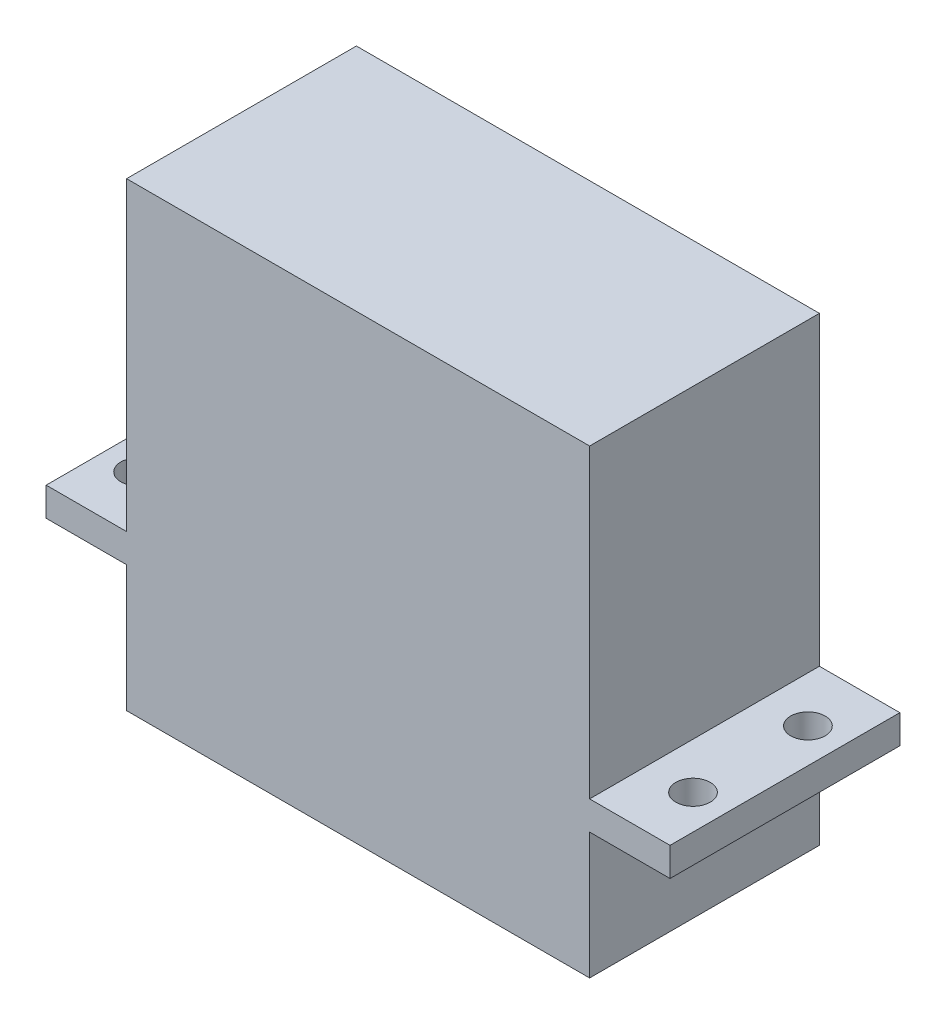
ISO-10303-21;
HEADER;
FILE_DESCRIPTION(('STEP AP214'),'2;1');
FILE_NAME('part.step','',(''),(''),'','','');
FILE_SCHEMA(('AUTOMOTIVE_DESIGN { 1 0 10303 214 1 1 1 1 }'));
ENDSEC;
DATA;
#1=APPLICATION_CONTEXT('core data for automotive mechanical design processes');
#2=APPLICATION_PROTOCOL_DEFINITION('international standard','automotive_design',2000,#1);
#3=PRODUCT_CONTEXT('',#1,'mechanical');
#4=PRODUCT('Part','Part','',(#3));
#5=PRODUCT_RELATED_PRODUCT_CATEGORY('part','',(#4));
#6=PRODUCT_DEFINITION_FORMATION('','',#4);
#7=PRODUCT_DEFINITION_CONTEXT('part definition',#1,'design');
#8=PRODUCT_DEFINITION('design','',#6,#7);
#9=PRODUCT_DEFINITION_SHAPE('','',#8);
#10=(LENGTH_UNIT() NAMED_UNIT(*) SI_UNIT(.MILLI.,.METRE.));
#11=(NAMED_UNIT(*) PLANE_ANGLE_UNIT() SI_UNIT($,.RADIAN.));
#12=(NAMED_UNIT(*) SI_UNIT($,.STERADIAN.) SOLID_ANGLE_UNIT());
#13=UNCERTAINTY_MEASURE_WITH_UNIT(LENGTH_MEASURE(1.E-05),#10,'distance_accuracy_value','');
#14=(GEOMETRIC_REPRESENTATION_CONTEXT(3) GLOBAL_UNCERTAINTY_ASSIGNED_CONTEXT((#13)) GLOBAL_UNIT_ASSIGNED_CONTEXT((#10,
#11,#12)) REPRESENTATION_CONTEXT('',''));
#15=CARTESIAN_POINT('',(0.,0.,0.));
#16=DIRECTION('',(0.,0.,1.));
#17=DIRECTION('',(1.,0.,0.));
#18=AXIS2_PLACEMENT_3D('',#15,#16,#17);
#19=CARTESIAN_POINT('',(-20.15,40.1,10.));
#20=DIRECTION('',(1.,0.,0.));
#21=DIRECTION('',(0.,0.,-1.));
#22=AXIS2_PLACEMENT_3D('',#19,#20,#21);
#23=PLANE('',#22);
#24=DIRECTION('',(0.,0.,-1.));
#25=VECTOR('',#24,1.);
#26=CARTESIAN_POINT('',(-20.15,13.5,-10.));
#27=LINE('',#26,#25);
#28=CARTESIAN_POINT('',(-20.15,13.5,10.));
#29=VERTEX_POINT('',#28);
#30=CARTESIAN_POINT('',(-20.15,13.5,-10.));
#31=VERTEX_POINT('',#30);
#32=EDGE_CURVE('E159',#29,#31,#27,.T.);
#33=ORIENTED_EDGE('',*,*,#32,.F.);
#34=DIRECTION('',(0.,-1.,0.));
#35=VECTOR('',#34,1.);
#36=CARTESIAN_POINT('',(-20.15,40.1,10.));
#37=LINE('',#36,#35);
#38=CARTESIAN_POINT('',(-20.15,40.1,10.));
#39=VERTEX_POINT('',#38);
#40=EDGE_CURVE('E241',#39,#29,#37,.T.);
#41=ORIENTED_EDGE('',*,*,#40,.F.);
#42=DIRECTION('',(0.,0.,1.));
#43=VECTOR('',#42,1.);
#44=CARTESIAN_POINT('',(-20.15,40.1,10.));
#45=LINE('',#44,#43);
#46=CARTESIAN_POINT('',(-20.15,40.1,-10.));
#47=VERTEX_POINT('',#46);
#48=EDGE_CURVE('E217',#47,#39,#45,.T.);
#49=ORIENTED_EDGE('',*,*,#48,.F.);
#50=DIRECTION('',(0.,-1.,0.));
#51=VECTOR('',#50,1.);
#52=CARTESIAN_POINT('',(-20.15,40.1,-10.));
#53=LINE('',#52,#51);
#54=EDGE_CURVE('E71',#47,#31,#53,.T.);
#55=ORIENTED_EDGE('',*,*,#54,.T.);
#56=EDGE_LOOP('',(#33,#41,#49,#55));
#57=FACE_BOUND('',#56,.T.);
#58=ADVANCED_FACE('F45',(#57),#23,.F.);
#59=DIRECTION('',(0.,0.,1.));
#60=VECTOR('',#59,1.);
#61=CARTESIAN_POINT('',(-20.15,11.,-10.));
#62=LINE('',#61,#60);
#63=CARTESIAN_POINT('',(-20.15,11.,-10.));
#64=VERTEX_POINT('',#63);
#65=CARTESIAN_POINT('',(-20.15,11.,10.));
#66=VERTEX_POINT('',#65);
#67=EDGE_CURVE('E63',#64,#66,#62,.T.);
#68=ORIENTED_EDGE('',*,*,#67,.F.);
#69=CARTESIAN_POINT('',(-20.15,0.,-10.));
#70=VERTEX_POINT('',#69);
#71=EDGE_CURVE('E163',#64,#70,#53,.T.);
#72=ORIENTED_EDGE('',*,*,#71,.T.);
#73=DIRECTION('',(0.,0.,1.));
#74=VECTOR('',#73,1.);
#75=CARTESIAN_POINT('',(-20.15,0.,10.));
#76=LINE('',#75,#74);
#77=CARTESIAN_POINT('',(-20.15,0.,10.));
#78=VERTEX_POINT('',#77);
#79=EDGE_CURVE('E230',#70,#78,#76,.T.);
#80=ORIENTED_EDGE('',*,*,#79,.T.);
#81=EDGE_CURVE('E240',#66,#78,#37,.T.);
#82=ORIENTED_EDGE('',*,*,#81,.F.);
#83=EDGE_LOOP('',(#68,#72,#80,#82));
#84=FACE_BOUND('',#83,.T.);
#85=ADVANCED_FACE('F311',(#84),#23,.F.);
#86=CARTESIAN_POINT('',(20.15,40.1,10.));
#87=DIRECTION('',(-1.,0.,0.));
#88=DIRECTION('',(0.,0.,1.));
#89=AXIS2_PLACEMENT_3D('',#86,#87,#88);
#90=PLANE('',#89);
#91=DIRECTION('',(0.,0.,1.));
#92=VECTOR('',#91,1.);
#93=CARTESIAN_POINT('',(20.15,13.5,10.));
#94=LINE('',#93,#92);
#95=CARTESIAN_POINT('',(20.15,13.5,-10.));
#96=VERTEX_POINT('',#95);
#97=CARTESIAN_POINT('',(20.15,13.5,10.));
#98=VERTEX_POINT('',#97);
#99=EDGE_CURVE('E170',#96,#98,#94,.T.);
#100=ORIENTED_EDGE('',*,*,#99,.F.);
#101=DIRECTION('',(0.,-1.,0.));
#102=VECTOR('',#101,1.);
#103=CARTESIAN_POINT('',(20.15,40.1,-10.));
#104=LINE('',#103,#102);
#105=CARTESIAN_POINT('',(20.15,40.1,-10.));
#106=VERTEX_POINT('',#105);
#107=EDGE_CURVE('E11',#106,#96,#104,.T.);
#108=ORIENTED_EDGE('',*,*,#107,.F.);
#109=DIRECTION('',(0.,0.,-1.));
#110=VECTOR('',#109,1.);
#111=CARTESIAN_POINT('',(20.15,40.1,10.));
#112=LINE('',#111,#110);
#113=CARTESIAN_POINT('',(20.15,40.1,10.));
#114=VERTEX_POINT('',#113);
#115=EDGE_CURVE('E209',#114,#106,#112,.T.);
#116=ORIENTED_EDGE('',*,*,#115,.F.);
#117=DIRECTION('',(0.,-1.,0.));
#118=VECTOR('',#117,1.);
#119=CARTESIAN_POINT('',(20.15,40.1,10.));
#120=LINE('',#119,#118);
#121=EDGE_CURVE('E237',#114,#98,#120,.T.);
#122=ORIENTED_EDGE('',*,*,#121,.T.);
#123=EDGE_LOOP('',(#100,#108,#116,#122));
#124=FACE_BOUND('',#123,.T.);
#125=ADVANCED_FACE('F47',(#124),#90,.F.);
#126=DIRECTION('',(0.,0.,-1.));
#127=VECTOR('',#126,1.);
#128=CARTESIAN_POINT('',(20.15,11.,10.));
#129=LINE('',#128,#127);
#130=CARTESIAN_POINT('',(20.15,11.,10.));
#131=VERTEX_POINT('',#130);
#132=CARTESIAN_POINT('',(20.15,11.,-10.));
#133=VERTEX_POINT('',#132);
#134=EDGE_CURVE('E165',#131,#133,#129,.T.);
#135=ORIENTED_EDGE('',*,*,#134,.F.);
#136=CARTESIAN_POINT('',(20.15,0.,10.));
#137=VERTEX_POINT('',#136);
#138=EDGE_CURVE('E223',#131,#137,#120,.T.);
#139=ORIENTED_EDGE('',*,*,#138,.T.);
#140=DIRECTION('',(0.,0.,-1.));
#141=VECTOR('',#140,1.);
#142=CARTESIAN_POINT('',(20.15,0.,10.));
#143=LINE('',#142,#141);
#144=CARTESIAN_POINT('',(20.15,0.,-10.));
#145=VERTEX_POINT('',#144);
#146=EDGE_CURVE('E208',#137,#145,#143,.T.);
#147=ORIENTED_EDGE('',*,*,#146,.T.);
#148=EDGE_CURVE('E55',#133,#145,#104,.T.);
#149=ORIENTED_EDGE('',*,*,#148,.F.);
#150=EDGE_LOOP('',(#135,#139,#147,#149));
#151=FACE_BOUND('',#150,.T.);
#152=ADVANCED_FACE('F304',(#151),#90,.F.);
#153=CARTESIAN_POINT('',(-20.15,40.1,-10.));
#154=DIRECTION('',(0.,0.,1.));
#155=DIRECTION('',(1.,0.,0.));
#156=AXIS2_PLACEMENT_3D('',#153,#154,#155);
#157=PLANE('',#156);
#158=DIRECTION('',(-1.,0.,0.));
#159=VECTOR('',#158,1.);
#160=CARTESIAN_POINT('',(-20.15,0.,-10.));
#161=LINE('',#160,#159);
#162=EDGE_CURVE('E227',#145,#70,#161,.T.);
#163=ORIENTED_EDGE('',*,*,#162,.T.);
#164=ORIENTED_EDGE('',*,*,#71,.F.);
#165=DIRECTION('',(1.,0.,0.));
#166=VECTOR('',#165,1.);
#167=CARTESIAN_POINT('',(-27.15,11.,-10.));
#168=LINE('',#167,#166);
#169=CARTESIAN_POINT('',(-27.15,11.,-10.));
#170=VERTEX_POINT('',#169);
#171=EDGE_CURVE('E142',#170,#64,#168,.T.);
#172=ORIENTED_EDGE('',*,*,#171,.F.);
#173=DIRECTION('',(0.,-1.,0.));
#174=VECTOR('',#173,1.);
#175=CARTESIAN_POINT('',(-27.15,11.,-10.));
#176=LINE('',#175,#174);
#177=CARTESIAN_POINT('',(-27.15,13.5,-10.));
#178=VERTEX_POINT('',#177);
#179=EDGE_CURVE('E149',#178,#170,#176,.T.);
#180=ORIENTED_EDGE('',*,*,#179,.F.);
#181=DIRECTION('',(1.,0.,0.));
#182=VECTOR('',#181,1.);
#183=CARTESIAN_POINT('',(-27.15,13.5,-10.));
#184=LINE('',#183,#182);
#185=EDGE_CURVE('E271',#178,#31,#184,.T.);
#186=ORIENTED_EDGE('',*,*,#185,.T.);
#187=ORIENTED_EDGE('',*,*,#54,.F.);
#188=DIRECTION('',(-1.,0.,0.));
#189=VECTOR('',#188,1.);
#190=CARTESIAN_POINT('',(-20.15,40.1,-10.));
#191=LINE('',#190,#189);
#192=EDGE_CURVE('E213',#106,#47,#191,.T.);
#193=ORIENTED_EDGE('',*,*,#192,.F.);
#194=ORIENTED_EDGE('',*,*,#107,.T.);
#195=DIRECTION('',(-1.,0.,0.));
#196=VECTOR('',#195,1.);
#197=CARTESIAN_POINT('',(27.15,13.5,-10.));
#198=LINE('',#197,#196);
#199=CARTESIAN_POINT('',(27.15,13.5,-10.));
#200=VERTEX_POINT('',#199);
#201=EDGE_CURVE('E196',#200,#96,#198,.T.);
#202=ORIENTED_EDGE('',*,*,#201,.F.);
#203=DIRECTION('',(0.,1.,0.));
#204=VECTOR('',#203,1.);
#205=CARTESIAN_POINT('',(27.15,13.5,-10.));
#206=LINE('',#205,#204);
#207=CARTESIAN_POINT('',(27.15,11.,-10.));
#208=VERTEX_POINT('',#207);
#209=EDGE_CURVE('E183',#208,#200,#206,.T.);
#210=ORIENTED_EDGE('',*,*,#209,.F.);
#211=DIRECTION('',(-1.,0.,0.));
#212=VECTOR('',#211,1.);
#213=CARTESIAN_POINT('',(27.15,11.,-10.));
#214=LINE('',#213,#212);
#215=EDGE_CURVE('E200',#208,#133,#214,.T.);
#216=ORIENTED_EDGE('',*,*,#215,.T.);
#217=ORIENTED_EDGE('',*,*,#148,.T.);
#218=EDGE_LOOP('',(#163,#164,#172,#180,#186,#187,#193,#194,#202,#210,#216,#217));
#219=FACE_BOUND('',#218,.T.);
#220=ADVANCED_FACE('F162',(#219),#157,.F.);
#221=CARTESIAN_POINT('',(-20.15,40.1,10.));
#222=DIRECTION('',(0.,0.,-1.));
#223=DIRECTION('',(-1.,0.,0.));
#224=AXIS2_PLACEMENT_3D('',#221,#222,#223);
#225=PLANE('',#224);
#226=DIRECTION('',(1.,0.,0.));
#227=VECTOR('',#226,1.);
#228=CARTESIAN_POINT('',(-20.15,0.,10.));
#229=LINE('',#228,#227);
#230=EDGE_CURVE('E214',#78,#137,#229,.T.);
#231=ORIENTED_EDGE('',*,*,#230,.T.);
#232=ORIENTED_EDGE('',*,*,#138,.F.);
#233=DIRECTION('',(-1.,0.,0.));
#234=VECTOR('',#233,1.);
#235=CARTESIAN_POINT('',(27.15,11.,10.));
#236=LINE('',#235,#234);
#237=CARTESIAN_POINT('',(27.15,11.,10.));
#238=VERTEX_POINT('',#237);
#239=EDGE_CURVE('E204',#238,#131,#236,.T.);
#240=ORIENTED_EDGE('',*,*,#239,.F.);
#241=DIRECTION('',(0.,-1.,0.));
#242=VECTOR('',#241,1.);
#243=CARTESIAN_POINT('',(27.15,13.5,10.));
#244=LINE('',#243,#242);
#245=CARTESIAN_POINT('',(27.15,13.5,10.));
#246=VERTEX_POINT('',#245);
#247=EDGE_CURVE('E176',#246,#238,#244,.T.);
#248=ORIENTED_EDGE('',*,*,#247,.F.);
#249=DIRECTION('',(-1.,0.,0.));
#250=VECTOR('',#249,1.);
#251=CARTESIAN_POINT('',(27.15,13.5,10.));
#252=LINE('',#251,#250);
#253=EDGE_CURVE('E188',#246,#98,#252,.T.);
#254=ORIENTED_EDGE('',*,*,#253,.T.);
#255=ORIENTED_EDGE('',*,*,#121,.F.);
#256=DIRECTION('',(1.,0.,0.));
#257=VECTOR('',#256,1.);
#258=CARTESIAN_POINT('',(-20.15,40.1,10.));
#259=LINE('',#258,#257);
#260=EDGE_CURVE('E220',#39,#114,#259,.T.);
#261=ORIENTED_EDGE('',*,*,#260,.F.);
#262=ORIENTED_EDGE('',*,*,#40,.T.);
#263=DIRECTION('',(1.,0.,0.));
#264=VECTOR('',#263,1.);
#265=CARTESIAN_POINT('',(-27.15,13.5,10.));
#266=LINE('',#265,#264);
#267=CARTESIAN_POINT('',(-27.15,13.5,10.));
#268=VERTEX_POINT('',#267);
#269=EDGE_CURVE('E172',#268,#29,#266,.T.);
#270=ORIENTED_EDGE('',*,*,#269,.F.);
#271=DIRECTION('',(0.,1.,0.));
#272=VECTOR('',#271,1.);
#273=CARTESIAN_POINT('',(-27.15,11.,10.));
#274=LINE('',#273,#272);
#275=CARTESIAN_POINT('',(-27.15,11.,10.));
#276=VERTEX_POINT('',#275);
#277=EDGE_CURVE('E148',#276,#268,#274,.T.);
#278=ORIENTED_EDGE('',*,*,#277,.F.);
#279=DIRECTION('',(1.,0.,0.));
#280=VECTOR('',#279,1.);
#281=CARTESIAN_POINT('',(-27.15,11.,10.));
#282=LINE('',#281,#280);
#283=EDGE_CURVE('E144',#276,#66,#282,.T.);
#284=ORIENTED_EDGE('',*,*,#283,.T.);
#285=ORIENTED_EDGE('',*,*,#81,.T.);
#286=EDGE_LOOP('',(#231,#232,#240,#248,#254,#255,#261,#262,#270,#278,#284,#285));
#287=FACE_BOUND('',#286,.T.);
#288=ADVANCED_FACE('F279',(#287),#225,.F.);
#289=CARTESIAN_POINT('',(0.,40.1,0.));
#290=DIRECTION('',(0.,-1.,0.));
#291=DIRECTION('',(0.,0.,-1.));
#292=AXIS2_PLACEMENT_3D('',#289,#290,#291);
#293=PLANE('',#292);
#294=ORIENTED_EDGE('',*,*,#115,.T.);
#295=ORIENTED_EDGE('',*,*,#192,.T.);
#296=ORIENTED_EDGE('',*,*,#48,.T.);
#297=ORIENTED_EDGE('',*,*,#260,.T.);
#298=EDGE_LOOP('',(#294,#295,#296,#297));
#299=FACE_BOUND('',#298,.T.);
#300=ADVANCED_FACE('F284',(#299),#293,.F.);
#301=CARTESIAN_POINT('',(0.,0.,0.));
#302=DIRECTION('',(0.,-1.,0.));
#303=DIRECTION('',(0.,0.,-1.));
#304=AXIS2_PLACEMENT_3D('',#301,#302,#303);
#305=PLANE('',#304);
#306=CARTESIAN_POINT('',(11.15,0.,0.));
#307=DIRECTION('',(0.,-1.,0.));
#308=DIRECTION('',(0.,0.,-1.));
#309=AXIS2_PLACEMENT_3D('',#306,#307,#308);
#310=CIRCLE('',#309,3.);
#311=CARTESIAN_POINT('',(11.15,0.,-3.));
#312=VERTEX_POINT('',#311);
#313=EDGE_CURVE('E494',#312,#312,#310,.T.);
#314=ORIENTED_EDGE('',*,*,#313,.F.);
#315=EDGE_LOOP('',(#314));
#316=FACE_BOUND('',#315,.T.);
#317=ORIENTED_EDGE('',*,*,#146,.F.);
#318=ORIENTED_EDGE('',*,*,#230,.F.);
#319=ORIENTED_EDGE('',*,*,#79,.F.);
#320=ORIENTED_EDGE('',*,*,#162,.F.);
#321=EDGE_LOOP('',(#317,#318,#319,#320));
#322=FACE_BOUND('',#321,.T.);
#323=ADVANCED_FACE('F314',(#316,#322),#305,.T.);
#324=CARTESIAN_POINT('',(27.15,11.,10.));
#325=DIRECTION('',(0.,1.,0.));
#326=DIRECTION('',(0.,0.,1.));
#327=AXIS2_PLACEMENT_3D('',#324,#325,#326);
#328=PLANE('',#327);
#329=CARTESIAN_POINT('',(24.15,11.,5.));
#330=DIRECTION('',(0.,-1.,0.));
#331=DIRECTION('',(0.,0.,-1.));
#332=AXIS2_PLACEMENT_3D('',#329,#330,#331);
#333=CIRCLE('',#332,1.5);
#334=CARTESIAN_POINT('',(24.15,11.,3.5));
#335=VERTEX_POINT('',#334);
#336=EDGE_CURVE('E499',#335,#335,#333,.T.);
#337=ORIENTED_EDGE('',*,*,#336,.F.);
#338=EDGE_LOOP('',(#337));
#339=FACE_BOUND('',#338,.T.);
#340=CARTESIAN_POINT('',(24.15,11.,-5.));
#341=DIRECTION('',(0.,-1.,0.));
#342=DIRECTION('',(0.,0.,-1.));
#343=AXIS2_PLACEMENT_3D('',#340,#341,#342);
#344=CIRCLE('',#343,1.5);
#345=CARTESIAN_POINT('',(24.15,11.,-6.5));
#346=VERTEX_POINT('',#345);
#347=EDGE_CURVE('E493',#346,#346,#344,.T.);
#348=ORIENTED_EDGE('',*,*,#347,.F.);
#349=EDGE_LOOP('',(#348));
#350=FACE_BOUND('',#349,.T.);
#351=ORIENTED_EDGE('',*,*,#134,.T.);
#352=ORIENTED_EDGE('',*,*,#215,.F.);
#353=DIRECTION('',(0.,0.,-1.));
#354=VECTOR('',#353,1.);
#355=CARTESIAN_POINT('',(27.15,11.,10.));
#356=LINE('',#355,#354);
#357=EDGE_CURVE('E180',#238,#208,#356,.T.);
#358=ORIENTED_EDGE('',*,*,#357,.F.);
#359=ORIENTED_EDGE('',*,*,#239,.T.);
#360=EDGE_LOOP('',(#351,#352,#358,#359));
#361=FACE_BOUND('',#360,.T.);
#362=ADVANCED_FACE('F301',(#339,#350,#361),#328,.F.);
#363=CARTESIAN_POINT('',(27.15,13.5,10.));
#364=DIRECTION('',(0.,-1.,0.));
#365=DIRECTION('',(0.,0.,-1.));
#366=AXIS2_PLACEMENT_3D('',#363,#364,#365);
#367=PLANE('',#366);
#368=CARTESIAN_POINT('',(24.15,13.5,5.));
#369=DIRECTION('',(0.,-1.,0.));
#370=DIRECTION('',(0.,0.,-1.));
#371=AXIS2_PLACEMENT_3D('',#368,#369,#370);
#372=CIRCLE('',#371,1.5);
#373=CARTESIAN_POINT('',(24.15,13.5,3.5));
#374=VERTEX_POINT('',#373);
#375=EDGE_CURVE('E49',#374,#374,#372,.T.);
#376=ORIENTED_EDGE('',*,*,#375,.T.);
#377=EDGE_LOOP('',(#376));
#378=FACE_BOUND('',#377,.T.);
#379=CARTESIAN_POINT('',(24.15,13.5,-5.));
#380=DIRECTION('',(0.,-1.,0.));
#381=DIRECTION('',(0.,0.,-1.));
#382=AXIS2_PLACEMENT_3D('',#379,#380,#381);
#383=CIRCLE('',#382,1.5);
#384=CARTESIAN_POINT('',(24.15,13.5,-6.5));
#385=VERTEX_POINT('',#384);
#386=EDGE_CURVE('E255',#385,#385,#383,.T.);
#387=ORIENTED_EDGE('',*,*,#386,.T.);
#388=EDGE_LOOP('',(#387));
#389=FACE_BOUND('',#388,.T.);
#390=ORIENTED_EDGE('',*,*,#99,.T.);
#391=ORIENTED_EDGE('',*,*,#253,.F.);
#392=DIRECTION('',(0.,0.,1.));
#393=VECTOR('',#392,1.);
#394=CARTESIAN_POINT('',(27.15,13.5,10.));
#395=LINE('',#394,#393);
#396=EDGE_CURVE('E186',#200,#246,#395,.T.);
#397=ORIENTED_EDGE('',*,*,#396,.F.);
#398=ORIENTED_EDGE('',*,*,#201,.T.);
#399=EDGE_LOOP('',(#390,#391,#397,#398));
#400=FACE_BOUND('',#399,.T.);
#401=ADVANCED_FACE('F292',(#378,#389,#400),#367,.F.);
#402=CARTESIAN_POINT('',(27.15,0.,0.));
#403=DIRECTION('',(1.,0.,0.));
#404=DIRECTION('',(0.,0.,-1.));
#405=AXIS2_PLACEMENT_3D('',#402,#403,#404);
#406=PLANE('',#405);
#407=ORIENTED_EDGE('',*,*,#247,.T.);
#408=ORIENTED_EDGE('',*,*,#357,.T.);
#409=ORIENTED_EDGE('',*,*,#209,.T.);
#410=ORIENTED_EDGE('',*,*,#396,.T.);
#411=EDGE_LOOP('',(#407,#408,#409,#410));
#412=FACE_BOUND('',#411,.T.);
#413=ADVANCED_FACE('F296',(#412),#406,.T.);
#414=CARTESIAN_POINT('',(-27.15,11.,-10.));
#415=DIRECTION('',(0.,1.,0.));
#416=DIRECTION('',(0.,0.,1.));
#417=AXIS2_PLACEMENT_3D('',#414,#415,#416);
#418=PLANE('',#417);
#419=CARTESIAN_POINT('',(-24.15,11.,-5.));
#420=DIRECTION('',(0.,-1.,0.));
#421=DIRECTION('',(0.,0.,-1.));
#422=AXIS2_PLACEMENT_3D('',#419,#420,#421);
#423=CIRCLE('',#422,1.5);
#424=CARTESIAN_POINT('',(-24.15,11.,-6.5));
#425=VERTEX_POINT('',#424);
#426=EDGE_CURVE('E504',#425,#425,#423,.T.);
#427=ORIENTED_EDGE('',*,*,#426,.F.);
#428=EDGE_LOOP('',(#427));
#429=FACE_BOUND('',#428,.T.);
#430=CARTESIAN_POINT('',(-24.15,11.,5.));
#431=DIRECTION('',(0.,-1.,0.));
#432=DIRECTION('',(0.,0.,-1.));
#433=AXIS2_PLACEMENT_3D('',#430,#431,#432);
#434=CIRCLE('',#433,1.5);
#435=CARTESIAN_POINT('',(-24.15,11.,3.5));
#436=VERTEX_POINT('',#435);
#437=EDGE_CURVE('E252',#436,#436,#434,.T.);
#438=ORIENTED_EDGE('',*,*,#437,.F.);
#439=EDGE_LOOP('',(#438));
#440=FACE_BOUND('',#439,.T.);
#441=ORIENTED_EDGE('',*,*,#67,.T.);
#442=ORIENTED_EDGE('',*,*,#283,.F.);
#443=DIRECTION('',(0.,0.,1.));
#444=VECTOR('',#443,1.);
#445=CARTESIAN_POINT('',(-27.15,11.,-10.));
#446=LINE('',#445,#444);
#447=EDGE_CURVE('E138',#170,#276,#446,.T.);
#448=ORIENTED_EDGE('',*,*,#447,.F.);
#449=ORIENTED_EDGE('',*,*,#171,.T.);
#450=EDGE_LOOP('',(#441,#442,#448,#449));
#451=FACE_BOUND('',#450,.T.);
#452=ADVANCED_FACE('F140',(#429,#440,#451),#418,.F.);
#453=CARTESIAN_POINT('',(-27.15,13.5,-10.));
#454=DIRECTION('',(0.,-1.,0.));
#455=DIRECTION('',(0.,0.,-1.));
#456=AXIS2_PLACEMENT_3D('',#453,#454,#455);
#457=PLANE('',#456);
#458=CARTESIAN_POINT('',(-24.15,13.5,-5.));
#459=DIRECTION('',(0.,-1.,0.));
#460=DIRECTION('',(0.,0.,-1.));
#461=AXIS2_PLACEMENT_3D('',#458,#459,#460);
#462=CIRCLE('',#461,1.5);
#463=CARTESIAN_POINT('',(-24.15,13.5,-6.5));
#464=VERTEX_POINT('',#463);
#465=EDGE_CURVE('E251',#464,#464,#462,.T.);
#466=ORIENTED_EDGE('',*,*,#465,.T.);
#467=EDGE_LOOP('',(#466));
#468=FACE_BOUND('',#467,.T.);
#469=CARTESIAN_POINT('',(-24.15,13.5,5.));
#470=DIRECTION('',(0.,-1.,0.));
#471=DIRECTION('',(0.,0.,-1.));
#472=AXIS2_PLACEMENT_3D('',#469,#470,#471);
#473=CIRCLE('',#472,1.5);
#474=CARTESIAN_POINT('',(-24.15,13.5,3.5));
#475=VERTEX_POINT('',#474);
#476=EDGE_CURVE('E247',#475,#475,#473,.T.);
#477=ORIENTED_EDGE('',*,*,#476,.T.);
#478=EDGE_LOOP('',(#477));
#479=FACE_BOUND('',#478,.T.);
#480=ORIENTED_EDGE('',*,*,#32,.T.);
#481=ORIENTED_EDGE('',*,*,#185,.F.);
#482=DIRECTION('',(0.,0.,-1.));
#483=VECTOR('',#482,1.);
#484=CARTESIAN_POINT('',(-27.15,13.5,-10.));
#485=LINE('',#484,#483);
#486=EDGE_CURVE('E154',#268,#178,#485,.T.);
#487=ORIENTED_EDGE('',*,*,#486,.F.);
#488=ORIENTED_EDGE('',*,*,#269,.T.);
#489=EDGE_LOOP('',(#480,#481,#487,#488));
#490=FACE_BOUND('',#489,.T.);
#491=ADVANCED_FACE('F277',(#468,#479,#490),#457,.F.);
#492=CARTESIAN_POINT('',(-27.15,0.,0.));
#493=DIRECTION('',(1.,0.,0.));
#494=DIRECTION('',(0.,0.,-1.));
#495=AXIS2_PLACEMENT_3D('',#492,#493,#494);
#496=PLANE('',#495);
#497=ORIENTED_EDGE('',*,*,#179,.T.);
#498=ORIENTED_EDGE('',*,*,#447,.T.);
#499=ORIENTED_EDGE('',*,*,#277,.T.);
#500=ORIENTED_EDGE('',*,*,#486,.T.);
#501=EDGE_LOOP('',(#497,#498,#499,#500));
#502=FACE_BOUND('',#501,.T.);
#503=ADVANCED_FACE('F152',(#502),#496,.F.);
#504=CARTESIAN_POINT('',(-24.15,18.,5.));
#505=DIRECTION('',(0.,-1.,0.));
#506=DIRECTION('',(0.,0.,-1.));
#507=AXIS2_PLACEMENT_3D('',#504,#505,#506);
#508=CYLINDRICAL_SURFACE('',#507,1.5);
#509=ORIENTED_EDGE('',*,*,#437,.T.);
#510=EDGE_LOOP('',(#509));
#511=FACE_BOUND('',#510,.T.);
#512=ORIENTED_EDGE('',*,*,#476,.F.);
#513=EDGE_LOOP('',(#512));
#514=FACE_BOUND('',#513,.T.);
#515=ADVANCED_FACE('F433',(#511,#514),#508,.F.);
#516=CARTESIAN_POINT('',(-24.15,18.,-5.));
#517=DIRECTION('',(0.,-1.,0.));
#518=DIRECTION('',(0.,0.,-1.));
#519=AXIS2_PLACEMENT_3D('',#516,#517,#518);
#520=CYLINDRICAL_SURFACE('',#519,1.5);
#521=ORIENTED_EDGE('',*,*,#426,.T.);
#522=EDGE_LOOP('',(#521));
#523=FACE_BOUND('',#522,.T.);
#524=ORIENTED_EDGE('',*,*,#465,.F.);
#525=EDGE_LOOP('',(#524));
#526=FACE_BOUND('',#525,.T.);
#527=ADVANCED_FACE('F441',(#523,#526),#520,.F.);
#528=CARTESIAN_POINT('',(24.15,18.,-5.));
#529=DIRECTION('',(0.,-1.,0.));
#530=DIRECTION('',(0.,0.,-1.));
#531=AXIS2_PLACEMENT_3D('',#528,#529,#530);
#532=CYLINDRICAL_SURFACE('',#531,1.5);
#533=ORIENTED_EDGE('',*,*,#347,.T.);
#534=EDGE_LOOP('',(#533));
#535=FACE_BOUND('',#534,.T.);
#536=ORIENTED_EDGE('',*,*,#386,.F.);
#537=EDGE_LOOP('',(#536));
#538=FACE_BOUND('',#537,.T.);
#539=ADVANCED_FACE('F450',(#535,#538),#532,.F.);
#540=CARTESIAN_POINT('',(24.15,18.,5.));
#541=DIRECTION('',(0.,-1.,0.));
#542=DIRECTION('',(0.,0.,-1.));
#543=AXIS2_PLACEMENT_3D('',#540,#541,#542);
#544=CYLINDRICAL_SURFACE('',#543,1.5);
#545=ORIENTED_EDGE('',*,*,#336,.T.);
#546=EDGE_LOOP('',(#545));
#547=FACE_BOUND('',#546,.T.);
#548=ORIENTED_EDGE('',*,*,#375,.F.);
#549=EDGE_LOOP('',(#548));
#550=FACE_BOUND('',#549,.T.);
#551=ADVANCED_FACE('F459',(#547,#550),#544,.F.);
#552=CARTESIAN_POINT('',(11.15,-3.5,0.));
#553=DIRECTION('',(0.,1.,0.));
#554=DIRECTION('',(0.,0.,1.));
#555=AXIS2_PLACEMENT_3D('',#552,#553,#554);
#556=CYLINDRICAL_SURFACE('',#555,3.);
#557=CARTESIAN_POINT('',(11.15,-3.5,0.));
#558=DIRECTION('',(0.,-1.,0.));
#559=DIRECTION('',(0.,0.,-1.));
#560=AXIS2_PLACEMENT_3D('',#557,#558,#559);
#561=CIRCLE('',#560,3.);
#562=CARTESIAN_POINT('',(11.15,-3.5,-3.));
#563=VERTEX_POINT('',#562);
#564=EDGE_CURVE('E491',#563,#563,#561,.T.);
#565=ORIENTED_EDGE('',*,*,#564,.F.);
#566=EDGE_LOOP('',(#565));
#567=FACE_BOUND('',#566,.T.);
#568=ORIENTED_EDGE('',*,*,#313,.T.);
#569=EDGE_LOOP('',(#568));
#570=FACE_BOUND('',#569,.T.);
#571=ADVANCED_FACE('F467',(#567,#570),#556,.T.);
#572=CARTESIAN_POINT('',(11.15,-3.5,0.));
#573=DIRECTION('',(0.,-1.,0.));
#574=DIRECTION('',(0.,0.,-1.));
#575=AXIS2_PLACEMENT_3D('',#572,#573,#574);
#576=PLANE('',#575);
#577=ORIENTED_EDGE('',*,*,#564,.T.);
#578=EDGE_LOOP('',(#577));
#579=FACE_BOUND('',#578,.T.);
#580=ADVANCED_FACE('F475',(#579),#576,.T.);
#581=CLOSED_SHELL('',(#58,#85,#125,#152,#220,#288,#300,#323,#362,#401,#413,#452,#491,#503,#515,
#527,#539,#551,#571,#580));
#582=MANIFOLD_SOLID_BREP('B2',#581);
#583=ADVANCED_BREP_SHAPE_REPRESENTATION('',(#18,#582),#14);
#584=SHAPE_DEFINITION_REPRESENTATION(#9,#583);
ENDSEC;
END-ISO-10303-21;
